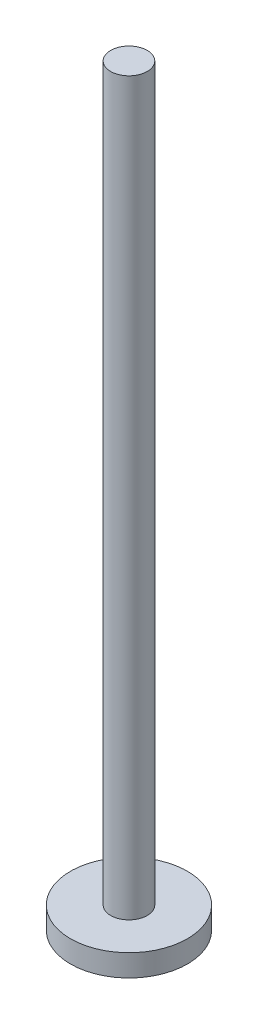
ISO-10303-21;
HEADER;
FILE_DESCRIPTION(('STEP AP214'),'2;1');
FILE_NAME('part.step','',(''),(''),'','','');
FILE_SCHEMA(('AUTOMOTIVE_DESIGN { 1 0 10303 214 1 1 1 1 }'));
ENDSEC;
DATA;
#1=APPLICATION_CONTEXT('core data for automotive mechanical design processes');
#2=APPLICATION_PROTOCOL_DEFINITION('international standard','automotive_design',2000,#1);
#3=PRODUCT_CONTEXT('',#1,'mechanical');
#4=PRODUCT('Part','Part','',(#3));
#5=PRODUCT_RELATED_PRODUCT_CATEGORY('part','',(#4));
#6=PRODUCT_DEFINITION_FORMATION('','',#4);
#7=PRODUCT_DEFINITION_CONTEXT('part definition',#1,'design');
#8=PRODUCT_DEFINITION('design','',#6,#7);
#9=PRODUCT_DEFINITION_SHAPE('','',#8);
#10=(LENGTH_UNIT() NAMED_UNIT(*) SI_UNIT(.MILLI.,.METRE.));
#11=(NAMED_UNIT(*) PLANE_ANGLE_UNIT() SI_UNIT($,.RADIAN.));
#12=(NAMED_UNIT(*) SI_UNIT($,.STERADIAN.) SOLID_ANGLE_UNIT());
#13=UNCERTAINTY_MEASURE_WITH_UNIT(LENGTH_MEASURE(1.E-05),#10,'distance_accuracy_value','');
#14=(GEOMETRIC_REPRESENTATION_CONTEXT(3) GLOBAL_UNCERTAINTY_ASSIGNED_CONTEXT((#13)) GLOBAL_UNIT_ASSIGNED_CONTEXT((#10,
#11,#12)) REPRESENTATION_CONTEXT('',''));
#15=CARTESIAN_POINT('',(0.,0.,0.));
#16=DIRECTION('',(0.,0.,1.));
#17=DIRECTION('',(1.,0.,0.));
#18=AXIS2_PLACEMENT_3D('',#15,#16,#17);
#19=CARTESIAN_POINT('',(0.,3.,0.));
#20=DIRECTION('',(0.,-1.,0.));
#21=DIRECTION('',(0.,0.,-1.));
#22=AXIS2_PLACEMENT_3D('',#19,#20,#21);
#23=CYLINDRICAL_SURFACE('',#22,8.);
#24=CARTESIAN_POINT('',(0.,3.,0.));
#25=DIRECTION('',(0.,1.,0.));
#26=DIRECTION('',(0.,0.,1.));
#27=AXIS2_PLACEMENT_3D('',#24,#25,#26);
#28=CIRCLE('',#27,8.);
#29=CARTESIAN_POINT('',(0.,3.,8.));
#30=VERTEX_POINT('',#29);
#31=EDGE_CURVE('E10',#30,#30,#28,.T.);
#32=ORIENTED_EDGE('',*,*,#31,.F.);
#33=EDGE_LOOP('',(#32));
#34=FACE_BOUND('',#33,.T.);
#35=CARTESIAN_POINT('',(0.,0.,0.));
#36=DIRECTION('',(0.,1.,0.));
#37=DIRECTION('',(0.,0.,1.));
#38=AXIS2_PLACEMENT_3D('',#35,#36,#37);
#39=CIRCLE('',#38,8.);
#40=CARTESIAN_POINT('',(0.,0.,8.));
#41=VERTEX_POINT('',#40);
#42=EDGE_CURVE('E35',#41,#41,#39,.T.);
#43=ORIENTED_EDGE('',*,*,#42,.T.);
#44=EDGE_LOOP('',(#43));
#45=FACE_BOUND('',#44,.T.);
#46=ADVANCED_FACE('F32',(#34,#45),#23,.T.);
#47=CARTESIAN_POINT('',(0.,3.,0.));
#48=DIRECTION('',(0.,1.,0.));
#49=DIRECTION('',(0.,0.,1.));
#50=AXIS2_PLACEMENT_3D('',#47,#48,#49);
#51=PLANE('',#50);
#52=CARTESIAN_POINT('',(0.,3.,0.));
#53=DIRECTION('',(0.,1.,0.));
#54=DIRECTION('',(0.,0.,1.));
#55=AXIS2_PLACEMENT_3D('',#52,#53,#54);
#56=CIRCLE('',#55,2.5);
#57=CARTESIAN_POINT('',(0.,3.,2.5));
#58=VERTEX_POINT('',#57);
#59=EDGE_CURVE('E44',#58,#58,#56,.T.);
#60=ORIENTED_EDGE('',*,*,#59,.F.);
#61=EDGE_LOOP('',(#60));
#62=FACE_BOUND('',#61,.T.);
#63=ORIENTED_EDGE('',*,*,#31,.T.);
#64=EDGE_LOOP('',(#63));
#65=FACE_BOUND('',#64,.T.);
#66=ADVANCED_FACE('F59',(#62,#65),#51,.T.);
#67=CARTESIAN_POINT('',(0.,0.,0.));
#68=DIRECTION('',(0.,1.,0.));
#69=DIRECTION('',(0.,0.,1.));
#70=AXIS2_PLACEMENT_3D('',#67,#68,#69);
#71=PLANE('',#70);
#72=ORIENTED_EDGE('',*,*,#42,.F.);
#73=EDGE_LOOP('',(#72));
#74=FACE_BOUND('',#73,.T.);
#75=ADVANCED_FACE('F55',(#74),#71,.F.);
#76=CARTESIAN_POINT('',(0.,103.,0.));
#77=DIRECTION('',(0.,-1.,0.));
#78=DIRECTION('',(0.,0.,-1.));
#79=AXIS2_PLACEMENT_3D('',#76,#77,#78);
#80=CYLINDRICAL_SURFACE('',#79,2.5);
#81=CARTESIAN_POINT('',(0.,103.,0.));
#82=DIRECTION('',(0.,1.,0.));
#83=DIRECTION('',(0.,0.,1.));
#84=AXIS2_PLACEMENT_3D('',#81,#82,#83);
#85=CIRCLE('',#84,2.5);
#86=CARTESIAN_POINT('',(0.,103.,2.5));
#87=VERTEX_POINT('',#86);
#88=EDGE_CURVE('E42',#87,#87,#85,.T.);
#89=ORIENTED_EDGE('',*,*,#88,.F.);
#90=EDGE_LOOP('',(#89));
#91=FACE_BOUND('',#90,.T.);
#92=ORIENTED_EDGE('',*,*,#59,.T.);
#93=EDGE_LOOP('',(#92));
#94=FACE_BOUND('',#93,.T.);
#95=ADVANCED_FACE('F52',(#91,#94),#80,.T.);
#96=CARTESIAN_POINT('',(0.,103.,0.));
#97=DIRECTION('',(0.,1.,0.));
#98=DIRECTION('',(0.,0.,1.));
#99=AXIS2_PLACEMENT_3D('',#96,#97,#98);
#100=PLANE('',#99);
#101=ORIENTED_EDGE('',*,*,#88,.T.);
#102=EDGE_LOOP('',(#101));
#103=FACE_BOUND('',#102,.T.);
#104=ADVANCED_FACE('F50',(#103),#100,.T.);
#105=CLOSED_SHELL('',(#46,#66,#75,#95,#104));
#106=MANIFOLD_SOLID_BREP('B2',#105);
#107=ADVANCED_BREP_SHAPE_REPRESENTATION('',(#18,#106),#14);
#108=SHAPE_DEFINITION_REPRESENTATION(#9,#107);
ENDSEC;
END-ISO-10303-21;
